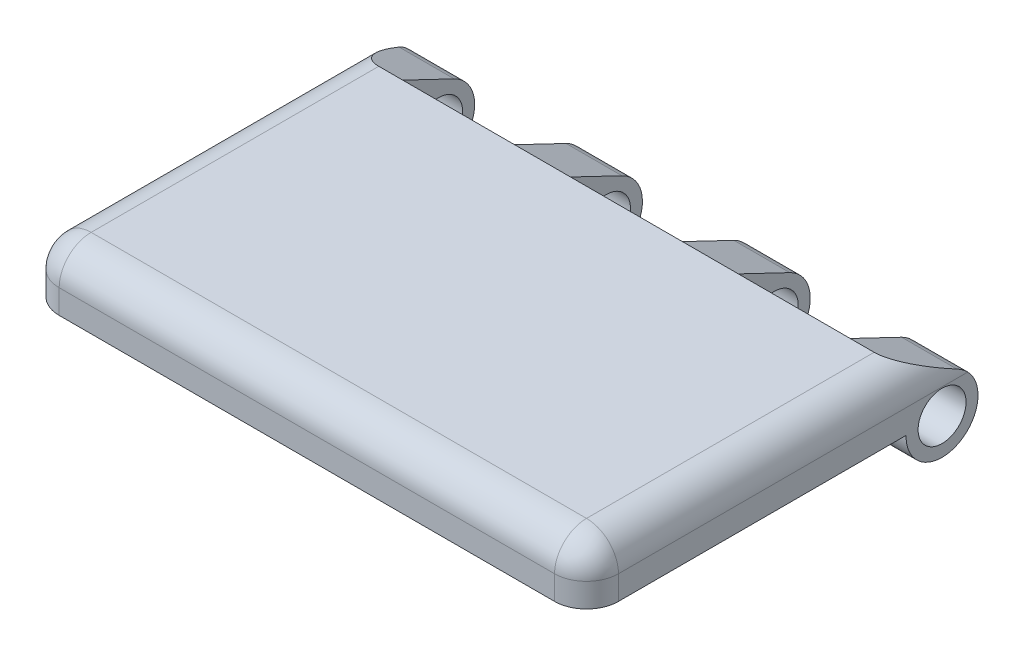
ISO-10303-21;
HEADER;
FILE_DESCRIPTION(('STEP AP214'),'2;1');
FILE_NAME('part.step','',(''),(''),'','','');
FILE_SCHEMA(('AUTOMOTIVE_DESIGN { 1 0 10303 214 1 1 1 1 }'));
ENDSEC;
DATA;
#1=APPLICATION_CONTEXT('core data for automotive mechanical design processes');
#2=APPLICATION_PROTOCOL_DEFINITION('international standard','automotive_design',2000,#1);
#3=PRODUCT_CONTEXT('',#1,'mechanical');
#4=PRODUCT('Part','Part','',(#3));
#5=PRODUCT_RELATED_PRODUCT_CATEGORY('part','',(#4));
#6=PRODUCT_DEFINITION_FORMATION('','',#4);
#7=PRODUCT_DEFINITION_CONTEXT('part definition',#1,'design');
#8=PRODUCT_DEFINITION('design','',#6,#7);
#9=PRODUCT_DEFINITION_SHAPE('','',#8);
#10=(LENGTH_UNIT() NAMED_UNIT(*) SI_UNIT(.MILLI.,.METRE.));
#11=(NAMED_UNIT(*) PLANE_ANGLE_UNIT() SI_UNIT($,.RADIAN.));
#12=(NAMED_UNIT(*) SI_UNIT($,.STERADIAN.) SOLID_ANGLE_UNIT());
#13=UNCERTAINTY_MEASURE_WITH_UNIT(LENGTH_MEASURE(1.E-05),#10,'distance_accuracy_value','');
#14=(GEOMETRIC_REPRESENTATION_CONTEXT(3) GLOBAL_UNCERTAINTY_ASSIGNED_CONTEXT((#13)) GLOBAL_UNIT_ASSIGNED_CONTEXT((#10,
#11,#12)) REPRESENTATION_CONTEXT('',''));
#15=CARTESIAN_POINT('',(0.,0.,0.));
#16=DIRECTION('',(0.,0.,1.));
#17=DIRECTION('',(1.,0.,0.));
#18=AXIS2_PLACEMENT_3D('',#15,#16,#17);
#19=CARTESIAN_POINT('',(17.5,3.5,-10.));
#20=DIRECTION('',(0.,0.,1.));
#21=DIRECTION('',(1.,0.,0.));
#22=AXIS2_PLACEMENT_3D('',#19,#20,#21);
#23=PLANE('',#22);
#24=DIRECTION('',(-1.,0.,0.));
#25=VECTOR('',#24,1.);
#26=CARTESIAN_POINT('',(17.5,0.,-10.));
#27=LINE('',#26,#25);
#28=CARTESIAN_POINT('',(-7.00000000000001,0.,-10.));
#29=VERTEX_POINT('',#28);
#30=CARTESIAN_POINT('',(-14.,0.,-9.99999999999999));
#31=VERTEX_POINT('',#30);
#32=EDGE_CURVE('E326',#29,#31,#27,.T.);
#33=ORIENTED_EDGE('',*,*,#32,.T.);
#34=DIRECTION('',(0.,1.,0.));
#35=VECTOR('',#34,1.);
#36=CARTESIAN_POINT('',(-14.,0.,-9.99999999999999));
#37=LINE('',#36,#35);
#38=CARTESIAN_POINT('',(-14.,3.5,-9.99999999999999));
#39=VERTEX_POINT('',#38);
#40=EDGE_CURVE('E399',#31,#39,#37,.T.);
#41=ORIENTED_EDGE('',*,*,#40,.T.);
#42=DIRECTION('',(-1.,0.,0.));
#43=VECTOR('',#42,1.);
#44=CARTESIAN_POINT('',(17.5,3.5,-10.));
#45=LINE('',#44,#43);
#46=CARTESIAN_POINT('',(-7.00000000000001,3.5,-10.));
#47=VERTEX_POINT('',#46);
#48=EDGE_CURVE('E318',#47,#39,#45,.T.);
#49=ORIENTED_EDGE('',*,*,#48,.F.);
#50=DIRECTION('',(0.,1.,0.));
#51=VECTOR('',#50,1.);
#52=CARTESIAN_POINT('',(-7.00000000000001,0.,-10.));
#53=LINE('',#52,#51);
#54=EDGE_CURVE('E221',#29,#47,#53,.T.);
#55=ORIENTED_EDGE('',*,*,#54,.F.);
#56=EDGE_LOOP('',(#33,#41,#49,#55));
#57=FACE_BOUND('',#56,.T.);
#58=ADVANCED_FACE('F46',(#57),#23,.F.);
#59=CARTESIAN_POINT('',(3.49999999999999,0.,-10.));
#60=VERTEX_POINT('',#59);
#61=CARTESIAN_POINT('',(-3.50000000000001,0.,-10.));
#62=VERTEX_POINT('',#61);
#63=EDGE_CURVE('E402',#60,#62,#27,.T.);
#64=ORIENTED_EDGE('',*,*,#63,.T.);
#65=DIRECTION('',(0.,1.,0.));
#66=VECTOR('',#65,1.);
#67=CARTESIAN_POINT('',(-3.50000000000001,0.,-10.));
#68=LINE('',#67,#66);
#69=CARTESIAN_POINT('',(-3.50000000000001,3.5,-10.));
#70=VERTEX_POINT('',#69);
#71=EDGE_CURVE('E232',#62,#70,#68,.T.);
#72=ORIENTED_EDGE('',*,*,#71,.T.);
#73=CARTESIAN_POINT('',(3.49999999999999,3.5,-10.));
#74=VERTEX_POINT('',#73);
#75=EDGE_CURVE('E547',#74,#70,#45,.T.);
#76=ORIENTED_EDGE('',*,*,#75,.F.);
#77=DIRECTION('',(0.,1.,0.));
#78=VECTOR('',#77,1.);
#79=CARTESIAN_POINT('',(3.49999999999999,0.,-10.));
#80=LINE('',#79,#78);
#81=EDGE_CURVE('E257',#60,#74,#80,.T.);
#82=ORIENTED_EDGE('',*,*,#81,.F.);
#83=EDGE_LOOP('',(#64,#72,#76,#82));
#84=FACE_BOUND('',#83,.T.);
#85=ADVANCED_FACE('F377',(#84),#23,.F.);
#86=CARTESIAN_POINT('',(14.,0.,-10.));
#87=VERTEX_POINT('',#86);
#88=CARTESIAN_POINT('',(6.99999999999999,0.,-10.));
#89=VERTEX_POINT('',#88);
#90=EDGE_CURVE('E331',#87,#89,#27,.T.);
#91=ORIENTED_EDGE('',*,*,#90,.T.);
#92=DIRECTION('',(0.,1.,0.));
#93=VECTOR('',#92,1.);
#94=CARTESIAN_POINT('',(6.99999999999999,0.,-10.));
#95=LINE('',#94,#93);
#96=CARTESIAN_POINT('',(6.99999999999999,3.5,-10.));
#97=VERTEX_POINT('',#96);
#98=EDGE_CURVE('E272',#89,#97,#95,.T.);
#99=ORIENTED_EDGE('',*,*,#98,.T.);
#100=CARTESIAN_POINT('',(14.,3.5,-10.));
#101=VERTEX_POINT('',#100);
#102=EDGE_CURVE('E317',#101,#97,#45,.T.);
#103=ORIENTED_EDGE('',*,*,#102,.F.);
#104=DIRECTION('',(0.,1.,0.));
#105=VECTOR('',#104,1.);
#106=CARTESIAN_POINT('',(14.,0.,-10.));
#107=LINE('',#106,#105);
#108=EDGE_CURVE('E297',#87,#101,#107,.T.);
#109=ORIENTED_EDGE('',*,*,#108,.F.);
#110=EDGE_LOOP('',(#91,#99,#103,#109));
#111=FACE_BOUND('',#110,.T.);
#112=ADVANCED_FACE('F374',(#111),#23,.F.);
#113=CARTESIAN_POINT('',(-17.5,3.5,-9.99999999999999));
#114=DIRECTION('',(1.,0.,0.));
#115=DIRECTION('',(0.,0.,-1.));
#116=AXIS2_PLACEMENT_3D('',#113,#114,#115);
#117=PLANE('',#116);
#118=DIRECTION('',(0.,-1.,0.));
#119=VECTOR('',#118,1.);
#120=CARTESIAN_POINT('',(-17.5,3.5,8.00000000000001));
#121=LINE('',#120,#119);
#122=CARTESIAN_POINT('',(-17.5,0.,8.00000000000001));
#123=VERTEX_POINT('',#122);
#124=CARTESIAN_POINT('',(-17.5,1.5,8.00000000000001));
#125=VERTEX_POINT('',#124);
#126=EDGE_CURVE('E72',#123,#125,#121,.F.);
#127=ORIENTED_EDGE('',*,*,#126,.T.);
#128=DIRECTION('',(0.,0.,1.));
#129=VECTOR('',#128,1.);
#130=CARTESIAN_POINT('',(-17.5,1.5,-9.99999999999999));
#131=LINE('',#130,#129);
#132=CARTESIAN_POINT('',(-17.5,1.5,-13.8596539394769));
#133=VERTEX_POINT('',#132);
#134=EDGE_CURVE('E177',#125,#133,#131,.F.);
#135=ORIENTED_EDGE('',*,*,#134,.T.);
#136=CARTESIAN_POINT('',(-17.5,-0.0709582879229792,-12.248880815289));
#137=DIRECTION('',(1.,0.,0.));
#138=DIRECTION('',(0.,0.,-1.));
#139=AXIS2_PLACEMENT_3D('',#136,#137,#138);
#140=CIRCLE('',#139,2.25);
#141=CARTESIAN_POINT('',(-17.5,0.,-9.99999999999999));
#142=VERTEX_POINT('',#141);
#143=EDGE_CURVE('E172',#133,#142,#140,.F.);
#144=ORIENTED_EDGE('',*,*,#143,.T.);
#145=DIRECTION('',(0.,0.,1.));
#146=VECTOR('',#145,1.);
#147=CARTESIAN_POINT('',(-17.5,0.,-9.99999999999999));
#148=LINE('',#147,#146);
#149=EDGE_CURVE('E176',#142,#123,#148,.T.);
#150=ORIENTED_EDGE('',*,*,#149,.T.);
#151=EDGE_LOOP('',(#127,#135,#144,#150));
#152=FACE_BOUND('',#151,.T.);
#153=CARTESIAN_POINT('',(-17.5,-0.0709582879229775,-12.248880815289));
#154=DIRECTION('',(1.,0.,0.));
#155=DIRECTION('',(0.,0.,-1.));
#156=AXIS2_PLACEMENT_3D('',#153,#154,#155);
#157=CIRCLE('',#156,1.5);
#158=CARTESIAN_POINT('',(-17.5,-0.0709582879229775,-13.748880815289));
#159=VERTEX_POINT('',#158);
#160=EDGE_CURVE('E180',#159,#159,#157,.T.);
#161=ORIENTED_EDGE('',*,*,#160,.T.);
#162=EDGE_LOOP('',(#161));
#163=FACE_BOUND('',#162,.T.);
#164=ADVANCED_FACE('F174',(#152,#163),#117,.F.);
#165=CARTESIAN_POINT('',(17.5,3.5,10.));
#166=DIRECTION('',(0.,0.,-1.));
#167=DIRECTION('',(-1.,0.,0.));
#168=AXIS2_PLACEMENT_3D('',#165,#166,#167);
#169=PLANE('',#168);
#170=DIRECTION('',(1.,0.,0.));
#171=VECTOR('',#170,1.);
#172=CARTESIAN_POINT('',(17.5,1.5,10.));
#173=LINE('',#172,#171);
#174=CARTESIAN_POINT('',(15.5,1.5,10.));
#175=VERTEX_POINT('',#174);
#176=CARTESIAN_POINT('',(-15.5,1.5,10.));
#177=VERTEX_POINT('',#176);
#178=EDGE_CURVE('E507',#175,#177,#173,.F.);
#179=ORIENTED_EDGE('',*,*,#178,.T.);
#180=DIRECTION('',(0.,-1.,0.));
#181=VECTOR('',#180,1.);
#182=CARTESIAN_POINT('',(-15.5,3.5,10.));
#183=LINE('',#182,#181);
#184=CARTESIAN_POINT('',(-15.5,0.,10.));
#185=VERTEX_POINT('',#184);
#186=EDGE_CURVE('E514',#177,#185,#183,.T.);
#187=ORIENTED_EDGE('',*,*,#186,.T.);
#188=DIRECTION('',(1.,0.,0.));
#189=VECTOR('',#188,1.);
#190=CARTESIAN_POINT('',(17.5,0.,10.));
#191=LINE('',#190,#189);
#192=CARTESIAN_POINT('',(15.5,0.,10.));
#193=VERTEX_POINT('',#192);
#194=EDGE_CURVE('E190',#185,#193,#191,.T.);
#195=ORIENTED_EDGE('',*,*,#194,.T.);
#196=DIRECTION('',(0.,-1.,0.));
#197=VECTOR('',#196,1.);
#198=CARTESIAN_POINT('',(15.5,3.5,10.));
#199=LINE('',#198,#197);
#200=EDGE_CURVE('E520',#193,#175,#199,.F.);
#201=ORIENTED_EDGE('',*,*,#200,.T.);
#202=EDGE_LOOP('',(#179,#187,#195,#201));
#203=FACE_BOUND('',#202,.T.);
#204=ADVANCED_FACE('F381',(#203),#169,.F.);
#205=CARTESIAN_POINT('',(17.5,3.5,-10.));
#206=DIRECTION('',(-1.,0.,0.));
#207=DIRECTION('',(0.,0.,1.));
#208=AXIS2_PLACEMENT_3D('',#205,#206,#207);
#209=PLANE('',#208);
#210=CARTESIAN_POINT('',(17.5,-0.0709582879229792,-12.248880815289));
#211=DIRECTION('',(1.,0.,0.));
#212=DIRECTION('',(0.,0.,-1.));
#213=AXIS2_PLACEMENT_3D('',#210,#211,#212);
#214=CIRCLE('',#213,2.25);
#215=CARTESIAN_POINT('',(17.5,1.5,-13.8596539394769));
#216=VERTEX_POINT('',#215);
#217=CARTESIAN_POINT('',(17.5,0.,-10.));
#218=VERTEX_POINT('',#217);
#219=EDGE_CURVE('E281',#216,#218,#214,.F.);
#220=ORIENTED_EDGE('',*,*,#219,.F.);
#221=DIRECTION('',(0.,0.,-1.));
#222=VECTOR('',#221,1.);
#223=CARTESIAN_POINT('',(17.5,1.5,-10.));
#224=LINE('',#223,#222);
#225=CARTESIAN_POINT('',(17.5,1.5,8.));
#226=VERTEX_POINT('',#225);
#227=EDGE_CURVE('E522',#216,#226,#224,.F.);
#228=ORIENTED_EDGE('',*,*,#227,.T.);
#229=DIRECTION('',(0.,-1.,0.));
#230=VECTOR('',#229,1.);
#231=CARTESIAN_POINT('',(17.5,3.5,8.));
#232=LINE('',#231,#230);
#233=CARTESIAN_POINT('',(17.5,0.,8.));
#234=VERTEX_POINT('',#233);
#235=EDGE_CURVE('E353',#226,#234,#232,.T.);
#236=ORIENTED_EDGE('',*,*,#235,.T.);
#237=DIRECTION('',(0.,0.,-1.));
#238=VECTOR('',#237,1.);
#239=CARTESIAN_POINT('',(17.5,0.,-10.));
#240=LINE('',#239,#238);
#241=EDGE_CURVE('E323',#234,#218,#240,.T.);
#242=ORIENTED_EDGE('',*,*,#241,.T.);
#243=EDGE_LOOP('',(#220,#228,#236,#242));
#244=FACE_BOUND('',#243,.T.);
#245=CARTESIAN_POINT('',(17.5,-0.0709582879229775,-12.248880815289));
#246=DIRECTION('',(1.,0.,0.));
#247=DIRECTION('',(0.,0.,-1.));
#248=AXIS2_PLACEMENT_3D('',#245,#246,#247);
#249=CIRCLE('',#248,1.5);
#250=CARTESIAN_POINT('',(17.5,-0.0709582879229775,-13.748880815289));
#251=VERTEX_POINT('',#250);
#252=EDGE_CURVE('E294',#251,#251,#249,.T.);
#253=ORIENTED_EDGE('',*,*,#252,.F.);
#254=EDGE_LOOP('',(#253));
#255=FACE_BOUND('',#254,.T.);
#256=ADVANCED_FACE('F370',(#244,#255),#209,.F.);
#257=CARTESIAN_POINT('',(0.,3.5,0.));
#258=DIRECTION('',(0.,-1.,0.));
#259=DIRECTION('',(0.,0.,-1.));
#260=AXIS2_PLACEMENT_3D('',#257,#258,#259);
#261=PLANE('',#260);
#262=DIRECTION('',(1.,0.,0.));
#263=VECTOR('',#262,1.);
#264=CARTESIAN_POINT('',(0.,3.5,8.));
#265=LINE('',#264,#263);
#266=CARTESIAN_POINT('',(-15.5,3.5,8.00000000000001));
#267=VERTEX_POINT('',#266);
#268=CARTESIAN_POINT('',(15.5,3.5,8.));
#269=VERTEX_POINT('',#268);
#270=EDGE_CURVE('E334',#267,#269,#265,.T.);
#271=ORIENTED_EDGE('',*,*,#270,.T.);
#272=DIRECTION('',(0.,0.,-1.));
#273=VECTOR('',#272,1.);
#274=CARTESIAN_POINT('',(15.5,3.5,0.));
#275=LINE('',#274,#273);
#276=CARTESIAN_POINT('',(15.5,3.5,-10.));
#277=VERTEX_POINT('',#276);
#278=EDGE_CURVE('E337',#269,#277,#275,.T.);
#279=ORIENTED_EDGE('',*,*,#278,.T.);
#280=EDGE_CURVE('E314',#277,#101,#45,.T.);
#281=ORIENTED_EDGE('',*,*,#280,.T.);
#282=ORIENTED_EDGE('',*,*,#102,.T.);
#283=DIRECTION('',(1.,0.,0.));
#284=VECTOR('',#283,1.);
#285=CARTESIAN_POINT('',(3.49999999999999,3.5,-10.));
#286=LINE('',#285,#284);
#287=EDGE_CURVE('E282',#74,#97,#286,.T.);
#288=ORIENTED_EDGE('',*,*,#287,.F.);
#289=ORIENTED_EDGE('',*,*,#75,.T.);
#290=DIRECTION('',(1.,0.,0.));
#291=VECTOR('',#290,1.);
#292=CARTESIAN_POINT('',(-7.00000000000001,3.5,-10.));
#293=LINE('',#292,#291);
#294=EDGE_CURVE('E242',#47,#70,#293,.T.);
#295=ORIENTED_EDGE('',*,*,#294,.F.);
#296=ORIENTED_EDGE('',*,*,#48,.T.);
#297=DIRECTION('',(1.,0.,0.));
#298=VECTOR('',#297,1.);
#299=CARTESIAN_POINT('',(-17.5,3.5,-9.99999999999999));
#300=LINE('',#299,#298);
#301=CARTESIAN_POINT('',(-15.5,3.5,-9.99999999999999));
#302=VERTEX_POINT('',#301);
#303=EDGE_CURVE('E199',#302,#39,#300,.T.);
#304=ORIENTED_EDGE('',*,*,#303,.F.);
#305=DIRECTION('',(0.,0.,1.));
#306=VECTOR('',#305,1.);
#307=CARTESIAN_POINT('',(-15.5,3.5,0.));
#308=LINE('',#307,#306);
#309=EDGE_CURVE('E316',#302,#267,#308,.T.);
#310=ORIENTED_EDGE('',*,*,#309,.T.);
#311=EDGE_LOOP('',(#271,#279,#281,#282,#288,#289,#295,#296,#304,#310));
#312=FACE_BOUND('',#311,.T.);
#313=ADVANCED_FACE('F367',(#312),#261,.F.);
#314=CARTESIAN_POINT('',(0.,0.,0.));
#315=DIRECTION('',(0.,-1.,0.));
#316=DIRECTION('',(0.,0.,-1.));
#317=AXIS2_PLACEMENT_3D('',#314,#315,#316);
#318=PLANE('',#317);
#319=ORIENTED_EDGE('',*,*,#194,.F.);
#320=CARTESIAN_POINT('',(-15.5,0.,8.00000000000001));
#321=DIRECTION('',(0.,-1.,0.));
#322=DIRECTION('',(0.,0.,-1.));
#323=AXIS2_PLACEMENT_3D('',#320,#321,#322);
#324=CIRCLE('',#323,2.);
#325=EDGE_CURVE('E11',#185,#123,#324,.T.);
#326=ORIENTED_EDGE('',*,*,#325,.T.);
#327=ORIENTED_EDGE('',*,*,#149,.F.);
#328=DIRECTION('',(1.,0.,0.));
#329=VECTOR('',#328,1.);
#330=CARTESIAN_POINT('',(-17.5,0.,-9.99999999999999));
#331=LINE('',#330,#329);
#332=EDGE_CURVE('E186',#142,#31,#331,.T.);
#333=ORIENTED_EDGE('',*,*,#332,.T.);
#334=ORIENTED_EDGE('',*,*,#32,.F.);
#335=DIRECTION('',(1.,0.,0.));
#336=VECTOR('',#335,1.);
#337=CARTESIAN_POINT('',(-7.00000000000001,0.,-10.));
#338=LINE('',#337,#336);
#339=EDGE_CURVE('E238',#29,#62,#338,.T.);
#340=ORIENTED_EDGE('',*,*,#339,.T.);
#341=ORIENTED_EDGE('',*,*,#63,.F.);
#342=DIRECTION('',(1.,0.,0.));
#343=VECTOR('',#342,1.);
#344=CARTESIAN_POINT('',(3.49999999999999,0.,-10.));
#345=LINE('',#344,#343);
#346=EDGE_CURVE('E278',#60,#89,#345,.T.);
#347=ORIENTED_EDGE('',*,*,#346,.T.);
#348=ORIENTED_EDGE('',*,*,#90,.F.);
#349=EDGE_CURVE('E327',#218,#87,#27,.T.);
#350=ORIENTED_EDGE('',*,*,#349,.F.);
#351=ORIENTED_EDGE('',*,*,#241,.F.);
#352=CARTESIAN_POINT('',(15.5,0.,8.));
#353=DIRECTION('',(0.,-1.,0.));
#354=DIRECTION('',(0.,0.,-1.));
#355=AXIS2_PLACEMENT_3D('',#352,#353,#354);
#356=CIRCLE('',#355,2.);
#357=EDGE_CURVE('E56',#234,#193,#356,.T.);
#358=ORIENTED_EDGE('',*,*,#357,.T.);
#359=EDGE_LOOP('',(#319,#326,#327,#333,#334,#340,#341,#347,#348,#350,#351,#358));
#360=FACE_BOUND('',#359,.T.);
#361=ADVANCED_FACE('F185',(#360),#318,.T.);
#362=CARTESIAN_POINT('',(14.,-0.0709582879229792,-12.248880815289));
#363=DIRECTION('',(1.,0.,0.));
#364=DIRECTION('',(0.,0.,-1.));
#365=AXIS2_PLACEMENT_3D('',#362,#363,#364);
#366=CYLINDRICAL_SURFACE('',#365,2.25);
#367=DIRECTION('',(1.,0.,0.));
#368=VECTOR('',#367,1.);
#369=CARTESIAN_POINT('',(14.,1.95851953673265,-13.2203332120801));
#370=LINE('',#369,#368);
#371=CARTESIAN_POINT('',(14.,1.95851953673265,-13.2203332120801));
#372=VERTEX_POINT('',#371);
#373=CARTESIAN_POINT('',(17.4467305500337,1.95851953673265,-13.2203332120801));
#374=VERTEX_POINT('',#373);
#375=EDGE_CURVE('E191',#372,#374,#370,.T.);
#376=ORIENTED_EDGE('',*,*,#375,.T.);
#377=CARTESIAN_POINT('',(17.4467305500337,1.95851953673265,-13.2203332120801));
#378=CARTESIAN_POINT('',(17.4534336404446,1.93002526727412,-13.2798684461662));
#379=CARTESIAN_POINT('',(17.4601125091656,1.89890062443738,-13.3381564160346));
#380=CARTESIAN_POINT('',(17.4725649466568,1.83188523273315,-13.4513678996401));
#381=CARTESIAN_POINT('',(17.4783455417851,1.79603600378256,-13.5063152398154));
#382=CARTESIAN_POINT('',(17.4882825790309,1.71958144290839,-13.6129812224225));
#383=CARTESIAN_POINT('',(17.4924387598004,1.67897534702872,-13.6646993441893));
#384=CARTESIAN_POINT('',(17.4983063248545,1.59296907355333,-13.7648797457964));
#385=CARTESIAN_POINT('',(17.4999970327413,1.54753174144806,-13.8133112783822));
#386=CARTESIAN_POINT('',(17.5,1.5,-13.8596539394769));
#387=B_SPLINE_CURVE_WITH_KNOTS('',3,(#377,#378,#379,#380,#381,#382,#383,#384,#385,#386),
.UNSPECIFIED.,.F.,.F.,(4,2,2,2,4),(0.,0.198975974223506,0.396307339703074,0.593670440295268,
0.792679369340015),.UNSPECIFIED.);
#388=EDGE_CURVE('E344',#374,#216,#387,.T.);
#389=ORIENTED_EDGE('',*,*,#388,.T.);
#390=ORIENTED_EDGE('',*,*,#219,.T.);
#391=ORIENTED_EDGE('',*,*,#349,.T.);
#392=CARTESIAN_POINT('',(14.,-0.0709582879229792,-12.248880815289));
#393=DIRECTION('',(1.,0.,0.));
#394=DIRECTION('',(0.,0.,-1.));
#395=AXIS2_PLACEMENT_3D('',#392,#393,#394);
#396=CIRCLE('',#395,2.25);
#397=EDGE_CURVE('E289',#372,#87,#396,.F.);
#398=ORIENTED_EDGE('',*,*,#397,.F.);
#399=EDGE_LOOP('',(#376,#389,#390,#391,#398));
#400=FACE_BOUND('',#399,.T.);
#401=ADVANCED_FACE('F359',(#400),#366,.T.);
#402=CARTESIAN_POINT('',(14.,6.74195393830145,-3.22717855442894));
#403=DIRECTION('',(0.,-0.901990144291391,0.431756620796018));
#404=DIRECTION('',(0.,-0.431756620796018,-0.901990144291391));
#405=AXIS2_PLACEMENT_3D('',#402,#403,#404);
#406=PLANE('',#405);
#407=ORIENTED_EDGE('',*,*,#280,.F.);
#408=CARTESIAN_POINT('',(15.5,1.5,-14.1782342219949));
#409=DIRECTION('',(0.,-0.901990144291391,0.431756620796018));
#410=DIRECTION('',(0.,-0.431756620796018,-0.901990144291391));
#411=AXIS2_PLACEMENT_3D('',#408,#409,#410);
#412=ELLIPSE('',#411,4.63223933037241,2.);
#413=EDGE_CURVE('E341',#277,#374,#412,.F.);
#414=ORIENTED_EDGE('',*,*,#413,.T.);
#415=ORIENTED_EDGE('',*,*,#375,.F.);
#416=DIRECTION('',(0.,-0.431756620796018,-0.901990144291391));
#417=VECTOR('',#416,1.);
#418=CARTESIAN_POINT('',(14.,6.74195393830145,-3.22717855442894));
#419=LINE('',#418,#417);
#420=EDGE_CURVE('E293',#101,#372,#419,.T.);
#421=ORIENTED_EDGE('',*,*,#420,.F.);
#422=EDGE_LOOP('',(#407,#414,#415,#421));
#423=FACE_BOUND('',#422,.T.);
#424=ADVANCED_FACE('F364',(#423),#406,.F.);
#425=CARTESIAN_POINT('',(14.,-0.0709582879229775,-12.248880815289));
#426=DIRECTION('',(1.,0.,0.));
#427=DIRECTION('',(0.,0.,-1.));
#428=AXIS2_PLACEMENT_3D('',#425,#426,#427);
#429=CYLINDRICAL_SURFACE('',#428,1.5);
#430=CARTESIAN_POINT('',(14.,-0.0709582879229775,-12.248880815289));
#431=DIRECTION('',(1.,0.,0.));
#432=DIRECTION('',(0.,0.,-1.));
#433=AXIS2_PLACEMENT_3D('',#430,#431,#432);
#434=CIRCLE('',#433,1.5);
#435=CARTESIAN_POINT('',(14.,-0.0709582879229775,-13.748880815289));
#436=VERTEX_POINT('',#435);
#437=EDGE_CURVE('E301',#436,#436,#434,.T.);
#438=ORIENTED_EDGE('',*,*,#437,.F.);
#439=EDGE_LOOP('',(#438));
#440=FACE_BOUND('',#439,.T.);
#441=ORIENTED_EDGE('',*,*,#252,.T.);
#442=EDGE_LOOP('',(#441));
#443=FACE_BOUND('',#442,.T.);
#444=ADVANCED_FACE('F552',(#440,#443),#429,.F.);
#445=CARTESIAN_POINT('',(14.,0.,0.));
#446=DIRECTION('',(1.,0.,0.));
#447=DIRECTION('',(0.,0.,-1.));
#448=AXIS2_PLACEMENT_3D('',#445,#446,#447);
#449=PLANE('',#448);
#450=ORIENTED_EDGE('',*,*,#397,.T.);
#451=ORIENTED_EDGE('',*,*,#108,.T.);
#452=ORIENTED_EDGE('',*,*,#420,.T.);
#453=EDGE_LOOP('',(#450,#451,#452));
#454=FACE_BOUND('',#453,.T.);
#455=ORIENTED_EDGE('',*,*,#437,.T.);
#456=EDGE_LOOP('',(#455));
#457=FACE_BOUND('',#456,.T.);
#458=ADVANCED_FACE('F549',(#454,#457),#449,.F.);
#459=CARTESIAN_POINT('',(3.49999999999999,-0.0709582879229792,-12.248880815289));
#460=DIRECTION('',(1.,0.,0.));
#461=DIRECTION('',(0.,0.,-1.));
#462=AXIS2_PLACEMENT_3D('',#459,#460,#461);
#463=CYLINDRICAL_SURFACE('',#462,2.25);
#464=CARTESIAN_POINT('',(6.99999999999999,-0.0709582879229792,-12.248880815289));
#465=DIRECTION('',(1.,0.,0.));
#466=DIRECTION('',(0.,0.,-1.));
#467=AXIS2_PLACEMENT_3D('',#464,#465,#466);
#468=CIRCLE('',#467,2.25);
#469=CARTESIAN_POINT('',(6.99999999999999,1.95851953673265,-13.2203332120801));
#470=VERTEX_POINT('',#469);
#471=EDGE_CURVE('E241',#470,#89,#468,.F.);
#472=ORIENTED_EDGE('',*,*,#471,.T.);
#473=ORIENTED_EDGE('',*,*,#346,.F.);
#474=CARTESIAN_POINT('',(3.49999999999999,-0.0709582879229792,-12.248880815289));
#475=DIRECTION('',(1.,0.,0.));
#476=DIRECTION('',(0.,0.,-1.));
#477=AXIS2_PLACEMENT_3D('',#474,#475,#476);
#478=CIRCLE('',#477,2.25);
#479=CARTESIAN_POINT('',(3.49999999999999,1.95851953673265,-13.2203332120801));
#480=VERTEX_POINT('',#479);
#481=EDGE_CURVE('E249',#480,#60,#478,.F.);
#482=ORIENTED_EDGE('',*,*,#481,.F.);
#483=DIRECTION('',(1.,0.,0.));
#484=VECTOR('',#483,1.);
#485=CARTESIAN_POINT('',(3.49999999999999,1.95851953673265,-13.2203332120801));
#486=LINE('',#485,#484);
#487=EDGE_CURVE('E265',#480,#470,#486,.T.);
#488=ORIENTED_EDGE('',*,*,#487,.T.);
#489=EDGE_LOOP('',(#472,#473,#482,#488));
#490=FACE_BOUND('',#489,.T.);
#491=ADVANCED_FACE('F551',(#490),#463,.T.);
#492=CARTESIAN_POINT('',(3.49999999999999,6.74195393830145,-3.22717855442894));
#493=DIRECTION('',(0.,-0.901990144291391,0.431756620796018));
#494=DIRECTION('',(0.,-0.431756620796018,-0.901990144291391));
#495=AXIS2_PLACEMENT_3D('',#492,#493,#494);
#496=PLANE('',#495);
#497=DIRECTION('',(0.,-0.431756620796018,-0.901990144291391));
#498=VECTOR('',#497,1.);
#499=CARTESIAN_POINT('',(6.99999999999999,6.74195393830145,-3.22717855442894));
#500=LINE('',#499,#498);
#501=EDGE_CURVE('E269',#97,#470,#500,.T.);
#502=ORIENTED_EDGE('',*,*,#501,.T.);
#503=ORIENTED_EDGE('',*,*,#487,.F.);
#504=DIRECTION('',(0.,-0.431756620796018,-0.901990144291391));
#505=VECTOR('',#504,1.);
#506=CARTESIAN_POINT('',(3.49999999999999,6.74195393830145,-3.22717855442894));
#507=LINE('',#506,#505);
#508=EDGE_CURVE('E253',#74,#480,#507,.T.);
#509=ORIENTED_EDGE('',*,*,#508,.F.);
#510=ORIENTED_EDGE('',*,*,#287,.T.);
#511=EDGE_LOOP('',(#502,#503,#509,#510));
#512=FACE_BOUND('',#511,.T.);
#513=ADVANCED_FACE('F565',(#512),#496,.F.);
#514=CARTESIAN_POINT('',(3.49999999999999,-0.0709582879229775,-12.248880815289));
#515=DIRECTION('',(1.,0.,0.));
#516=DIRECTION('',(0.,0.,-1.));
#517=AXIS2_PLACEMENT_3D('',#514,#515,#516);
#518=CYLINDRICAL_SURFACE('',#517,1.5);
#519=CARTESIAN_POINT('',(3.49999999999999,-0.0709582879229775,-12.248880815289));
#520=DIRECTION('',(1.,0.,0.));
#521=DIRECTION('',(0.,0.,-1.));
#522=AXIS2_PLACEMENT_3D('',#519,#520,#521);
#523=CIRCLE('',#522,1.5);
#524=CARTESIAN_POINT('',(3.49999999999999,-0.0709582879229775,-13.748880815289));
#525=VERTEX_POINT('',#524);
#526=EDGE_CURVE('E261',#525,#525,#523,.T.);
#527=ORIENTED_EDGE('',*,*,#526,.F.);
#528=EDGE_LOOP('',(#527));
#529=FACE_BOUND('',#528,.T.);
#530=CARTESIAN_POINT('',(6.99999999999999,-0.0709582879229775,-12.248880815289));
#531=DIRECTION('',(1.,0.,0.));
#532=DIRECTION('',(0.,0.,-1.));
#533=AXIS2_PLACEMENT_3D('',#530,#531,#532);
#534=CIRCLE('',#533,1.5);
#535=CARTESIAN_POINT('',(6.99999999999999,-0.0709582879229775,-13.748880815289));
#536=VERTEX_POINT('',#535);
#537=EDGE_CURVE('E254',#536,#536,#534,.T.);
#538=ORIENTED_EDGE('',*,*,#537,.T.);
#539=EDGE_LOOP('',(#538));
#540=FACE_BOUND('',#539,.T.);
#541=ADVANCED_FACE('F569',(#529,#540),#518,.F.);
#542=CARTESIAN_POINT('',(3.49999999999999,0.,0.));
#543=DIRECTION('',(1.,0.,0.));
#544=DIRECTION('',(0.,0.,-1.));
#545=AXIS2_PLACEMENT_3D('',#542,#543,#544);
#546=PLANE('',#545);
#547=ORIENTED_EDGE('',*,*,#481,.T.);
#548=ORIENTED_EDGE('',*,*,#81,.T.);
#549=ORIENTED_EDGE('',*,*,#508,.T.);
#550=EDGE_LOOP('',(#547,#548,#549));
#551=FACE_BOUND('',#550,.T.);
#552=ORIENTED_EDGE('',*,*,#526,.T.);
#553=EDGE_LOOP('',(#552));
#554=FACE_BOUND('',#553,.T.);
#555=ADVANCED_FACE('F573',(#551,#554),#546,.F.);
#556=CARTESIAN_POINT('',(6.99999999999999,0.,0.));
#557=DIRECTION('',(1.,0.,0.));
#558=DIRECTION('',(0.,0.,-1.));
#559=AXIS2_PLACEMENT_3D('',#556,#557,#558);
#560=PLANE('',#559);
#561=ORIENTED_EDGE('',*,*,#471,.F.);
#562=ORIENTED_EDGE('',*,*,#501,.F.);
#563=ORIENTED_EDGE('',*,*,#98,.F.);
#564=EDGE_LOOP('',(#561,#562,#563));
#565=FACE_BOUND('',#564,.T.);
#566=ORIENTED_EDGE('',*,*,#537,.F.);
#567=EDGE_LOOP('',(#566));
#568=FACE_BOUND('',#567,.T.);
#569=ADVANCED_FACE('F575',(#565,#568),#560,.T.);
#570=CARTESIAN_POINT('',(-7.00000000000001,-0.0709582879229792,-12.248880815289));
#571=DIRECTION('',(1.,0.,0.));
#572=DIRECTION('',(0.,0.,-1.));
#573=AXIS2_PLACEMENT_3D('',#570,#571,#572);
#574=CYLINDRICAL_SURFACE('',#573,2.25);
#575=CARTESIAN_POINT('',(-3.50000000000001,-0.0709582879229792,-12.248880815289));
#576=DIRECTION('',(1.,0.,0.));
#577=DIRECTION('',(0.,0.,-1.));
#578=AXIS2_PLACEMENT_3D('',#575,#576,#577);
#579=CIRCLE('',#578,2.25);
#580=CARTESIAN_POINT('',(-3.50000000000001,1.95851953673265,-13.2203332120801));
#581=VERTEX_POINT('',#580);
#582=EDGE_CURVE('E198',#581,#62,#579,.F.);
#583=ORIENTED_EDGE('',*,*,#582,.T.);
#584=ORIENTED_EDGE('',*,*,#339,.F.);
#585=CARTESIAN_POINT('',(-7.00000000000001,-0.0709582879229792,-12.248880815289));
#586=DIRECTION('',(1.,0.,0.));
#587=DIRECTION('',(0.,0.,-1.));
#588=AXIS2_PLACEMENT_3D('',#585,#586,#587);
#589=CIRCLE('',#588,2.25);
#590=CARTESIAN_POINT('',(-7.00000000000001,1.95851953673265,-13.2203332120801));
#591=VERTEX_POINT('',#590);
#592=EDGE_CURVE('E213',#591,#29,#589,.F.);
#593=ORIENTED_EDGE('',*,*,#592,.F.);
#594=DIRECTION('',(1.,0.,0.));
#595=VECTOR('',#594,1.);
#596=CARTESIAN_POINT('',(-7.00000000000001,1.95851953673265,-13.2203332120801));
#597=LINE('',#596,#595);
#598=EDGE_CURVE('E228',#591,#581,#597,.T.);
#599=ORIENTED_EDGE('',*,*,#598,.T.);
#600=EDGE_LOOP('',(#583,#584,#593,#599));
#601=FACE_BOUND('',#600,.T.);
#602=ADVANCED_FACE('F578',(#601),#574,.T.);
#603=CARTESIAN_POINT('',(-7.00000000000001,6.74195393830145,-3.22717855442894));
#604=DIRECTION('',(0.,-0.901990144291391,0.431756620796018));
#605=DIRECTION('',(0.,-0.431756620796018,-0.901990144291391));
#606=AXIS2_PLACEMENT_3D('',#603,#604,#605);
#607=PLANE('',#606);
#608=DIRECTION('',(0.,-0.431756620796018,-0.901990144291391));
#609=VECTOR('',#608,1.);
#610=CARTESIAN_POINT('',(-3.50000000000001,6.74195393830145,-3.22717855442894));
#611=LINE('',#610,#609);
#612=EDGE_CURVE('E204',#70,#581,#611,.T.);
#613=ORIENTED_EDGE('',*,*,#612,.T.);
#614=ORIENTED_EDGE('',*,*,#598,.F.);
#615=DIRECTION('',(0.,-0.431756620796018,-0.901990144291391));
#616=VECTOR('',#615,1.);
#617=CARTESIAN_POINT('',(-7.00000000000001,6.74195393830145,-3.22717855442894));
#618=LINE('',#617,#616);
#619=EDGE_CURVE('E217',#47,#591,#618,.T.);
#620=ORIENTED_EDGE('',*,*,#619,.F.);
#621=ORIENTED_EDGE('',*,*,#294,.T.);
#622=EDGE_LOOP('',(#613,#614,#620,#621));
#623=FACE_BOUND('',#622,.T.);
#624=ADVANCED_FACE('F585',(#623),#607,.F.);
#625=CARTESIAN_POINT('',(-7.00000000000001,-0.0709582879229775,-12.248880815289));
#626=DIRECTION('',(1.,0.,0.));
#627=DIRECTION('',(0.,0.,-1.));
#628=AXIS2_PLACEMENT_3D('',#625,#626,#627);
#629=CYLINDRICAL_SURFACE('',#628,1.5);
#630=CARTESIAN_POINT('',(-7.00000000000001,-0.0709582879229775,-12.248880815289));
#631=DIRECTION('',(1.,0.,0.));
#632=DIRECTION('',(0.,0.,-1.));
#633=AXIS2_PLACEMENT_3D('',#630,#631,#632);
#634=CIRCLE('',#633,1.5);
#635=CARTESIAN_POINT('',(-7.00000000000001,-0.0709582879229775,-13.748880815289));
#636=VERTEX_POINT('',#635);
#637=EDGE_CURVE('E225',#636,#636,#634,.T.);
#638=ORIENTED_EDGE('',*,*,#637,.F.);
#639=EDGE_LOOP('',(#638));
#640=FACE_BOUND('',#639,.T.);
#641=CARTESIAN_POINT('',(-3.50000000000001,-0.0709582879229775,-12.248880815289));
#642=DIRECTION('',(1.,0.,0.));
#643=DIRECTION('',(0.,0.,-1.));
#644=AXIS2_PLACEMENT_3D('',#641,#642,#643);
#645=CIRCLE('',#644,1.5);
#646=CARTESIAN_POINT('',(-3.50000000000001,-0.0709582879229775,-13.748880815289));
#647=VERTEX_POINT('',#646);
#648=EDGE_CURVE('E218',#647,#647,#645,.T.);
#649=ORIENTED_EDGE('',*,*,#648,.T.);
#650=EDGE_LOOP('',(#649));
#651=FACE_BOUND('',#650,.T.);
#652=ADVANCED_FACE('F589',(#640,#651),#629,.F.);
#653=CARTESIAN_POINT('',(-7.00000000000001,0.,0.));
#654=DIRECTION('',(1.,0.,0.));
#655=DIRECTION('',(0.,0.,-1.));
#656=AXIS2_PLACEMENT_3D('',#653,#654,#655);
#657=PLANE('',#656);
#658=ORIENTED_EDGE('',*,*,#592,.T.);
#659=ORIENTED_EDGE('',*,*,#54,.T.);
#660=ORIENTED_EDGE('',*,*,#619,.T.);
#661=EDGE_LOOP('',(#658,#659,#660));
#662=FACE_BOUND('',#661,.T.);
#663=ORIENTED_EDGE('',*,*,#637,.T.);
#664=EDGE_LOOP('',(#663));
#665=FACE_BOUND('',#664,.T.);
#666=ADVANCED_FACE('F441',(#662,#665),#657,.F.);
#667=CARTESIAN_POINT('',(-3.50000000000001,0.,0.));
#668=DIRECTION('',(1.,0.,0.));
#669=DIRECTION('',(0.,0.,-1.));
#670=AXIS2_PLACEMENT_3D('',#667,#668,#669);
#671=PLANE('',#670);
#672=ORIENTED_EDGE('',*,*,#582,.F.);
#673=ORIENTED_EDGE('',*,*,#612,.F.);
#674=ORIENTED_EDGE('',*,*,#71,.F.);
#675=EDGE_LOOP('',(#672,#673,#674));
#676=FACE_BOUND('',#675,.T.);
#677=ORIENTED_EDGE('',*,*,#648,.F.);
#678=EDGE_LOOP('',(#677));
#679=FACE_BOUND('',#678,.T.);
#680=ADVANCED_FACE('F440',(#676,#679),#671,.T.);
#681=CARTESIAN_POINT('',(-17.5,-0.0709582879229792,-12.248880815289));
#682=DIRECTION('',(1.,0.,0.));
#683=DIRECTION('',(0.,0.,-1.));
#684=AXIS2_PLACEMENT_3D('',#681,#682,#683);
#685=CYLINDRICAL_SURFACE('',#684,2.25);
#686=ORIENTED_EDGE('',*,*,#143,.F.);
#687=CARTESIAN_POINT('',(-17.5,1.5,-13.8596539394769));
#688=CARTESIAN_POINT('',(-17.4999970327413,1.54753174144806,-13.8133112783822));
#689=CARTESIAN_POINT('',(-17.4983063248545,1.59296907355333,-13.7648797457964));
#690=CARTESIAN_POINT('',(-17.4924387598004,1.67897534702872,-13.6646993441893));
#691=CARTESIAN_POINT('',(-17.488282579031,1.7195814429084,-13.6129812224225));
#692=CARTESIAN_POINT('',(-17.4783455417851,1.79603600378256,-13.5063152398154));
#693=CARTESIAN_POINT('',(-17.4725649466568,1.83188523273314,-13.4513678996401));
#694=CARTESIAN_POINT('',(-17.4601125091656,1.89890062443738,-13.3381564160346));
#695=CARTESIAN_POINT('',(-17.4534336404447,1.93002526727412,-13.2798684461662));
#696=CARTESIAN_POINT('',(-17.4467305500337,1.95851953673265,-13.2203332120801));
#697=B_SPLINE_CURVE_WITH_KNOTS('',3,(#687,#688,#689,#690,#691,#692,#693,#694,#695,#696),
.UNSPECIFIED.,.F.,.F.,(4,2,2,2,4),(0.,0.199008929044749,0.396372029636943,0.593703395116507,
0.792679369340014),.UNSPECIFIED.);
#698=CARTESIAN_POINT('',(-17.4467305500337,1.95851953673265,-13.2203332120801));
#699=VERTEX_POINT('',#698);
#700=EDGE_CURVE('E64',#133,#699,#697,.T.);
#701=ORIENTED_EDGE('',*,*,#700,.T.);
#702=DIRECTION('',(1.,0.,0.));
#703=VECTOR('',#702,1.);
#704=CARTESIAN_POINT('',(-17.5,1.95851953673265,-13.2203332120801));
#705=LINE('',#704,#703);
#706=CARTESIAN_POINT('',(-14.,1.95851953673265,-13.2203332120801));
#707=VERTEX_POINT('',#706);
#708=EDGE_CURVE('E206',#699,#707,#705,.T.);
#709=ORIENTED_EDGE('',*,*,#708,.T.);
#710=CARTESIAN_POINT('',(-14.,-0.0709582879229792,-12.248880815289));
#711=DIRECTION('',(1.,0.,0.));
#712=DIRECTION('',(0.,0.,-1.));
#713=AXIS2_PLACEMENT_3D('',#710,#711,#712);
#714=CIRCLE('',#713,2.25);
#715=EDGE_CURVE('E196',#707,#31,#714,.F.);
#716=ORIENTED_EDGE('',*,*,#715,.T.);
#717=ORIENTED_EDGE('',*,*,#332,.F.);
#718=EDGE_LOOP('',(#686,#701,#709,#716,#717));
#719=FACE_BOUND('',#718,.T.);
#720=ADVANCED_FACE('F194',(#719),#685,.T.);
#721=CARTESIAN_POINT('',(-17.5,6.74195393830145,-3.22717855442893));
#722=DIRECTION('',(0.,-0.901990144291391,0.431756620796018));
#723=DIRECTION('',(0.,-0.431756620796018,-0.901990144291391));
#724=AXIS2_PLACEMENT_3D('',#721,#722,#723);
#725=PLANE('',#724);
#726=ORIENTED_EDGE('',*,*,#708,.F.);
#727=CARTESIAN_POINT('',(-15.5,1.5,-14.1782342219949));
#728=DIRECTION('',(0.,-0.901990144291391,0.431756620796018));
#729=DIRECTION('',(0.,0.431756620796018,0.901990144291391));
#730=AXIS2_PLACEMENT_3D('',#727,#728,#729);
#731=ELLIPSE('',#730,4.63223933037241,2.);
#732=EDGE_CURVE('E451',#699,#302,#731,.F.);
#733=ORIENTED_EDGE('',*,*,#732,.T.);
#734=ORIENTED_EDGE('',*,*,#303,.T.);
#735=DIRECTION('',(0.,-0.431756620796018,-0.901990144291391));
#736=VECTOR('',#735,1.);
#737=CARTESIAN_POINT('',(-14.,6.74195393830145,-3.22717855442893));
#738=LINE('',#737,#736);
#739=EDGE_CURVE('E408',#39,#707,#738,.T.);
#740=ORIENTED_EDGE('',*,*,#739,.T.);
#741=EDGE_LOOP('',(#726,#733,#734,#740));
#742=FACE_BOUND('',#741,.T.);
#743=ADVANCED_FACE('F424',(#742),#725,.F.);
#744=CARTESIAN_POINT('',(-17.5,-0.0709582879229775,-12.248880815289));
#745=DIRECTION('',(1.,0.,0.));
#746=DIRECTION('',(0.,0.,-1.));
#747=AXIS2_PLACEMENT_3D('',#744,#745,#746);
#748=CYLINDRICAL_SURFACE('',#747,1.5);
#749=ORIENTED_EDGE('',*,*,#160,.F.);
#750=EDGE_LOOP('',(#749));
#751=FACE_BOUND('',#750,.T.);
#752=CARTESIAN_POINT('',(-14.,-0.0709582879229775,-12.248880815289));
#753=DIRECTION('',(1.,0.,0.));
#754=DIRECTION('',(0.,0.,-1.));
#755=AXIS2_PLACEMENT_3D('',#752,#753,#754);
#756=CIRCLE('',#755,1.5);
#757=CARTESIAN_POINT('',(-14.,-0.0709582879229775,-13.748880815289));
#758=VERTEX_POINT('',#757);
#759=EDGE_CURVE('E181',#758,#758,#756,.T.);
#760=ORIENTED_EDGE('',*,*,#759,.T.);
#761=EDGE_LOOP('',(#760));
#762=FACE_BOUND('',#761,.T.);
#763=ADVANCED_FACE('F421',(#751,#762),#748,.F.);
#764=CARTESIAN_POINT('',(-14.,0.,0.));
#765=DIRECTION('',(1.,0.,0.));
#766=DIRECTION('',(0.,0.,-1.));
#767=AXIS2_PLACEMENT_3D('',#764,#765,#766);
#768=PLANE('',#767);
#769=ORIENTED_EDGE('',*,*,#715,.F.);
#770=ORIENTED_EDGE('',*,*,#739,.F.);
#771=ORIENTED_EDGE('',*,*,#40,.F.);
#772=EDGE_LOOP('',(#769,#770,#771));
#773=FACE_BOUND('',#772,.T.);
#774=ORIENTED_EDGE('',*,*,#759,.F.);
#775=EDGE_LOOP('',(#774));
#776=FACE_BOUND('',#775,.T.);
#777=ADVANCED_FACE('F405',(#773,#776),#768,.T.);
#778=CARTESIAN_POINT('',(-15.5,3.5,8.00000000000001));
#779=DIRECTION('',(0.,-1.,0.));
#780=DIRECTION('',(0.,0.,-1.));
#781=AXIS2_PLACEMENT_3D('',#778,#779,#780);
#782=CYLINDRICAL_SURFACE('',#781,2.);
#783=ORIENTED_EDGE('',*,*,#325,.F.);
#784=ORIENTED_EDGE('',*,*,#186,.F.);
#785=CARTESIAN_POINT('',(-15.5,1.5,8.00000000000001));
#786=DIRECTION('',(0.,1.,0.));
#787=DIRECTION('',(0.,0.,1.));
#788=AXIS2_PLACEMENT_3D('',#785,#786,#787);
#789=CIRCLE('',#788,2.);
#790=EDGE_CURVE('E50',#125,#177,#789,.T.);
#791=ORIENTED_EDGE('',*,*,#790,.F.);
#792=ORIENTED_EDGE('',*,*,#126,.F.);
#793=EDGE_LOOP('',(#783,#784,#791,#792));
#794=FACE_BOUND('',#793,.T.);
#795=ADVANCED_FACE('F48',(#794),#782,.T.);
#796=CARTESIAN_POINT('',(-15.5,1.5,0.));
#797=DIRECTION('',(0.,0.,1.));
#798=DIRECTION('',(1.,0.,0.));
#799=AXIS2_PLACEMENT_3D('',#796,#797,#798);
#800=CYLINDRICAL_SURFACE('',#799,2.);
#801=ORIENTED_EDGE('',*,*,#700,.F.);
#802=ORIENTED_EDGE('',*,*,#134,.F.);
#803=CARTESIAN_POINT('',(-15.5,1.5,8.00000000000001));
#804=DIRECTION('',(0.,0.,1.));
#805=DIRECTION('',(1.,0.,0.));
#806=AXIS2_PLACEMENT_3D('',#803,#804,#805);
#807=CIRCLE('',#806,2.);
#808=EDGE_CURVE('E498',#267,#125,#807,.T.);
#809=ORIENTED_EDGE('',*,*,#808,.F.);
#810=ORIENTED_EDGE('',*,*,#309,.F.);
#811=ORIENTED_EDGE('',*,*,#732,.F.);
#812=EDGE_LOOP('',(#801,#802,#809,#810,#811));
#813=FACE_BOUND('',#812,.T.);
#814=ADVANCED_FACE('F431',(#813),#800,.T.);
#815=CARTESIAN_POINT('',(-15.5,1.5,8.00000000000001));
#816=DIRECTION('',(-1.,0.,0.));
#817=DIRECTION('',(0.,0.,1.));
#818=AXIS2_PLACEMENT_3D('',#815,#816,#817);
#819=SPHERICAL_SURFACE('',#818,2.);
#820=ORIENTED_EDGE('',*,*,#808,.T.);
#821=ORIENTED_EDGE('',*,*,#790,.T.);
#822=CARTESIAN_POINT('',(-15.5,1.5,8.00000000000001));
#823=DIRECTION('',(-1.,0.,0.));
#824=DIRECTION('',(0.,-1.,0.));
#825=AXIS2_PLACEMENT_3D('',#822,#823,#824);
#826=CIRCLE('',#825,2.);
#827=EDGE_CURVE('E492',#267,#177,#826,.F.);
#828=ORIENTED_EDGE('',*,*,#827,.F.);
#829=EDGE_LOOP('',(#820,#821,#828));
#830=FACE_BOUND('',#829,.T.);
#831=ADVANCED_FACE('F457',(#830),#819,.T.);
#832=CARTESIAN_POINT('',(15.5,3.5,8.));
#833=DIRECTION('',(0.,-1.,0.));
#834=DIRECTION('',(0.,0.,-1.));
#835=AXIS2_PLACEMENT_3D('',#832,#833,#834);
#836=CYLINDRICAL_SURFACE('',#835,2.);
#837=ORIENTED_EDGE('',*,*,#357,.F.);
#838=ORIENTED_EDGE('',*,*,#235,.F.);
#839=CARTESIAN_POINT('',(15.5,1.5,8.));
#840=DIRECTION('',(0.,1.,0.));
#841=DIRECTION('',(0.,0.,1.));
#842=AXIS2_PLACEMENT_3D('',#839,#840,#841);
#843=CIRCLE('',#842,2.);
#844=EDGE_CURVE('E482',#175,#226,#843,.T.);
#845=ORIENTED_EDGE('',*,*,#844,.F.);
#846=ORIENTED_EDGE('',*,*,#200,.F.);
#847=EDGE_LOOP('',(#837,#838,#845,#846));
#848=FACE_BOUND('',#847,.T.);
#849=ADVANCED_FACE('F461',(#848),#836,.T.);
#850=CARTESIAN_POINT('',(0.,1.5,8.));
#851=DIRECTION('',(1.,0.,0.));
#852=DIRECTION('',(0.,0.,-1.));
#853=AXIS2_PLACEMENT_3D('',#850,#851,#852);
#854=CYLINDRICAL_SURFACE('',#853,2.);
#855=ORIENTED_EDGE('',*,*,#827,.T.);
#856=ORIENTED_EDGE('',*,*,#178,.F.);
#857=CARTESIAN_POINT('',(15.5,1.5,8.));
#858=DIRECTION('',(1.,0.,0.));
#859=DIRECTION('',(0.,0.,-1.));
#860=AXIS2_PLACEMENT_3D('',#857,#858,#859);
#861=CIRCLE('',#860,2.);
#862=EDGE_CURVE('E480',#269,#175,#861,.T.);
#863=ORIENTED_EDGE('',*,*,#862,.F.);
#864=ORIENTED_EDGE('',*,*,#270,.F.);
#865=EDGE_LOOP('',(#855,#856,#863,#864));
#866=FACE_BOUND('',#865,.T.);
#867=ADVANCED_FACE('F465',(#866),#854,.T.);
#868=CARTESIAN_POINT('',(15.5,1.5,8.));
#869=DIRECTION('',(0.,0.,1.));
#870=DIRECTION('',(1.,0.,0.));
#871=AXIS2_PLACEMENT_3D('',#868,#869,#870);
#872=SPHERICAL_SURFACE('',#871,2.);
#873=ORIENTED_EDGE('',*,*,#862,.T.);
#874=ORIENTED_EDGE('',*,*,#844,.T.);
#875=CARTESIAN_POINT('',(15.5,1.5,8.));
#876=DIRECTION('',(0.,0.,1.));
#877=DIRECTION('',(0.,-1.,0.));
#878=AXIS2_PLACEMENT_3D('',#875,#876,#877);
#879=CIRCLE('',#878,2.);
#880=EDGE_CURVE('E484',#269,#226,#879,.F.);
#881=ORIENTED_EDGE('',*,*,#880,.F.);
#882=EDGE_LOOP('',(#873,#874,#881));
#883=FACE_BOUND('',#882,.T.);
#884=ADVANCED_FACE('F468',(#883),#872,.T.);
#885=CARTESIAN_POINT('',(15.5,1.5,0.));
#886=DIRECTION('',(0.,0.,-1.));
#887=DIRECTION('',(-1.,0.,0.));
#888=AXIS2_PLACEMENT_3D('',#885,#886,#887);
#889=CYLINDRICAL_SURFACE('',#888,2.);
#890=ORIENTED_EDGE('',*,*,#880,.T.);
#891=ORIENTED_EDGE('',*,*,#227,.F.);
#892=ORIENTED_EDGE('',*,*,#388,.F.);
#893=ORIENTED_EDGE('',*,*,#413,.F.);
#894=ORIENTED_EDGE('',*,*,#278,.F.);
#895=EDGE_LOOP('',(#890,#891,#892,#893,#894));
#896=FACE_BOUND('',#895,.T.);
#897=ADVANCED_FACE('F355',(#896),#889,.T.);
#898=CLOSED_SHELL('',(#58,#85,#112,#164,#204,#256,#313,#361,#401,#424,#444,#458,#491,#513,#541,
#555,#569,#602,#624,#652,#666,#680,#720,#743,#763,#777,#795,#814,#831,#849,#867,#884,#897));
#899=MANIFOLD_SOLID_BREP('B2',#898);
#900=ADVANCED_BREP_SHAPE_REPRESENTATION('',(#18,#899),#14);
#901=SHAPE_DEFINITION_REPRESENTATION(#9,#900);
ENDSEC;
END-ISO-10303-21;
